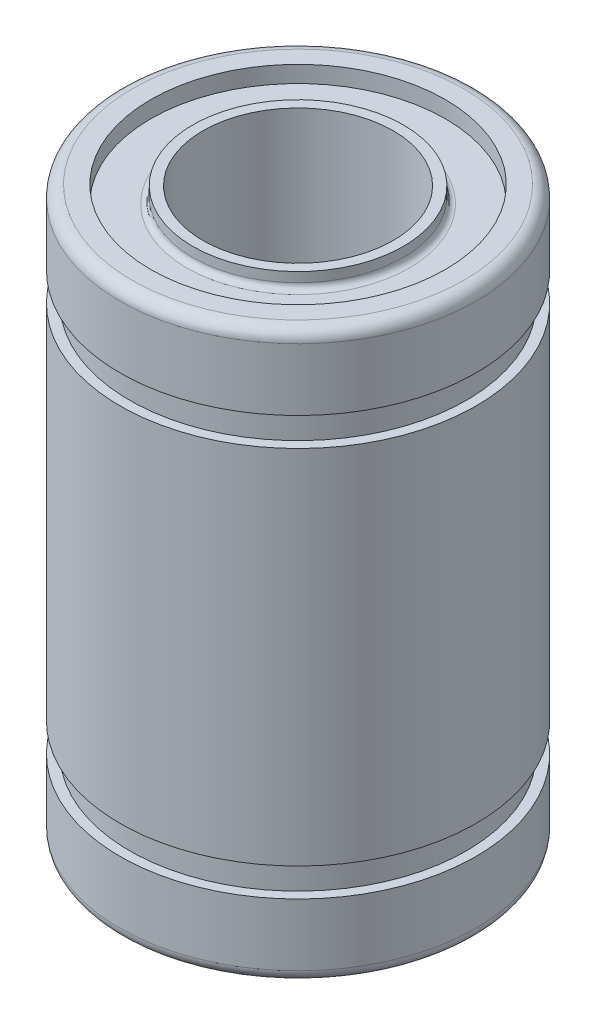
ISO-10303-21;
HEADER;
FILE_DESCRIPTION(('STEP AP214'),'2;1');
FILE_NAME('part.step','',(''),(''),'','','');
FILE_SCHEMA(('AUTOMOTIVE_DESIGN { 1 0 10303 214 1 1 1 1 }'));
ENDSEC;
DATA;
#1=APPLICATION_CONTEXT('core data for automotive mechanical design processes');
#2=APPLICATION_PROTOCOL_DEFINITION('international standard','automotive_design',2000,#1);
#3=PRODUCT_CONTEXT('',#1,'mechanical');
#4=PRODUCT('Part','Part','',(#3));
#5=PRODUCT_RELATED_PRODUCT_CATEGORY('part','',(#4));
#6=PRODUCT_DEFINITION_FORMATION('','',#4);
#7=PRODUCT_DEFINITION_CONTEXT('part definition',#1,'design');
#8=PRODUCT_DEFINITION('design','',#6,#7);
#9=PRODUCT_DEFINITION_SHAPE('','',#8);
#10=(LENGTH_UNIT() NAMED_UNIT(*) SI_UNIT(.MILLI.,.METRE.));
#11=(NAMED_UNIT(*) PLANE_ANGLE_UNIT() SI_UNIT($,.RADIAN.));
#12=(NAMED_UNIT(*) SI_UNIT($,.STERADIAN.) SOLID_ANGLE_UNIT());
#13=UNCERTAINTY_MEASURE_WITH_UNIT(LENGTH_MEASURE(1.E-05),#10,'distance_accuracy_value','');
#14=(GEOMETRIC_REPRESENTATION_CONTEXT(3) GLOBAL_UNCERTAINTY_ASSIGNED_CONTEXT((#13)) GLOBAL_UNIT_ASSIGNED_CONTEXT((#10,
#11,#12)) REPRESENTATION_CONTEXT('',''));
#15=CARTESIAN_POINT('',(0.,0.,0.));
#16=DIRECTION('',(0.,0.,1.));
#17=DIRECTION('',(1.,0.,0.));
#18=AXIS2_PLACEMENT_3D('',#15,#16,#17);
#19=CARTESIAN_POINT('',(0.,11.921250002041,0.));
#20=DIRECTION('',(0.,-1.,0.));
#21=DIRECTION('',(0.,0.,-1.));
#22=AXIS2_PLACEMENT_3D('',#19,#20,#21);
#23=CYLINDRICAL_SURFACE('',#22,4.425);
#24=CARTESIAN_POINT('',(0.,11.8804,0.));
#25=DIRECTION('',(0.,-1.,0.));
#26=DIRECTION('',(0.,0.,-1.));
#27=AXIS2_PLACEMENT_3D('',#24,#25,#26);
#28=CIRCLE('',#27,4.425);
#29=CARTESIAN_POINT('',(0.,11.8804,-4.425));
#30=VERTEX_POINT('',#29);
#31=EDGE_CURVE('E107',#30,#30,#28,.T.);
#32=ORIENTED_EDGE('',*,*,#31,.T.);
#33=EDGE_LOOP('',(#32));
#34=FACE_BOUND('',#33,.T.);
#35=CARTESIAN_POINT('',(0.,11.474,0.));
#36=DIRECTION('',(0.,-1.,0.));
#37=DIRECTION('',(0.,0.,-1.));
#38=AXIS2_PLACEMENT_3D('',#35,#36,#37);
#39=CIRCLE('',#38,4.425);
#40=CARTESIAN_POINT('',(0.,11.474,-4.425));
#41=VERTEX_POINT('',#40);
#42=EDGE_CURVE('E10',#41,#41,#39,.T.);
#43=ORIENTED_EDGE('',*,*,#42,.F.);
#44=EDGE_LOOP('',(#43));
#45=FACE_BOUND('',#44,.T.);
#46=ADVANCED_FACE('F31',(#34,#45),#23,.T.);
#47=CARTESIAN_POINT('',(0.,11.474,0.));
#48=DIRECTION('',(0.,-1.,0.));
#49=DIRECTION('',(0.,0.,-1.));
#50=AXIS2_PLACEMENT_3D('',#47,#48,#49);
#51=TOROIDAL_SURFACE('',#50,4.679,0.254);
#52=ORIENTED_EDGE('',*,*,#42,.T.);
#53=EDGE_LOOP('',(#52));
#54=FACE_BOUND('',#53,.T.);
#55=CARTESIAN_POINT('',(0.,11.22,0.));
#56=DIRECTION('',(0.,-1.,0.));
#57=DIRECTION('',(0.,0.,-1.));
#58=AXIS2_PLACEMENT_3D('',#55,#56,#57);
#59=CIRCLE('',#58,4.679);
#60=CARTESIAN_POINT('',(0.,11.22,-4.679));
#61=VERTEX_POINT('',#60);
#62=EDGE_CURVE('E37',#61,#61,#59,.T.);
#63=ORIENTED_EDGE('',*,*,#62,.F.);
#64=EDGE_LOOP('',(#63));
#65=FACE_BOUND('',#64,.T.);
#66=ADVANCED_FACE('F125',(#54,#65),#51,.F.);
#67=CARTESIAN_POINT('',(6.19,11.22,0.));
#68=DIRECTION('',(0.,1.,0.));
#69=DIRECTION('',(0.,0.,1.));
#70=AXIS2_PLACEMENT_3D('',#67,#68,#69);
#71=PLANE('',#70);
#72=ORIENTED_EDGE('',*,*,#62,.T.);
#73=EDGE_LOOP('',(#72));
#74=FACE_BOUND('',#73,.T.);
#75=CARTESIAN_POINT('',(0.,11.22,0.));
#76=DIRECTION('',(0.,-1.,0.));
#77=DIRECTION('',(0.,0.,-1.));
#78=AXIS2_PLACEMENT_3D('',#75,#76,#77);
#79=CIRCLE('',#78,6.19);
#80=CARTESIAN_POINT('',(0.,11.22,-6.19));
#81=VERTEX_POINT('',#80);
#82=EDGE_CURVE('E41',#81,#81,#79,.T.);
#83=ORIENTED_EDGE('',*,*,#82,.F.);
#84=EDGE_LOOP('',(#83));
#85=FACE_BOUND('',#84,.T.);
#86=ADVANCED_FACE('F129',(#74,#85),#71,.T.);
#87=CARTESIAN_POINT('',(0.,11.921250002041,0.));
#88=DIRECTION('',(0.,-1.,0.));
#89=DIRECTION('',(0.,0.,-1.));
#90=AXIS2_PLACEMENT_3D('',#87,#88,#89);
#91=CYLINDRICAL_SURFACE('',#90,6.19);
#92=ORIENTED_EDGE('',*,*,#82,.T.);
#93=EDGE_LOOP('',(#92));
#94=FACE_BOUND('',#93,.T.);
#95=CARTESIAN_POINT('',(0.,11.92,0.));
#96=DIRECTION('',(0.,-1.,0.));
#97=DIRECTION('',(0.,0.,-1.));
#98=AXIS2_PLACEMENT_3D('',#95,#96,#97);
#99=CIRCLE('',#98,6.19);
#100=CARTESIAN_POINT('',(0.,11.92,-6.19));
#101=VERTEX_POINT('',#100);
#102=EDGE_CURVE('E45',#101,#101,#99,.T.);
#103=ORIENTED_EDGE('',*,*,#102,.F.);
#104=EDGE_LOOP('',(#103));
#105=FACE_BOUND('',#104,.T.);
#106=ADVANCED_FACE('F133',(#94,#105),#91,.F.);
#107=CARTESIAN_POINT('',(6.972,11.92,0.));
#108=DIRECTION('',(0.,1.,0.));
#109=DIRECTION('',(0.,0.,1.));
#110=AXIS2_PLACEMENT_3D('',#107,#108,#109);
#111=PLANE('',#110);
#112=ORIENTED_EDGE('',*,*,#102,.T.);
#113=EDGE_LOOP('',(#112));
#114=FACE_BOUND('',#113,.T.);
#115=CARTESIAN_POINT('',(0.,11.92,0.));
#116=DIRECTION('',(0.,-1.,0.));
#117=DIRECTION('',(0.,0.,-1.));
#118=AXIS2_PLACEMENT_3D('',#115,#116,#117);
#119=CIRCLE('',#118,6.972);
#120=CARTESIAN_POINT('',(0.,11.92,-6.972));
#121=VERTEX_POINT('',#120);
#122=EDGE_CURVE('E50',#121,#121,#119,.T.);
#123=ORIENTED_EDGE('',*,*,#122,.F.);
#124=EDGE_LOOP('',(#123));
#125=FACE_BOUND('',#124,.T.);
#126=ADVANCED_FACE('F139',(#114,#125),#111,.T.);
#127=CARTESIAN_POINT('',(0.,11.412,0.));
#128=DIRECTION('',(0.,-1.,0.));
#129=DIRECTION('',(0.,0.,-1.));
#130=AXIS2_PLACEMENT_3D('',#127,#128,#129);
#131=TOROIDAL_SURFACE('',#130,6.972,0.507999999999999);
#132=ORIENTED_EDGE('',*,*,#122,.T.);
#133=EDGE_LOOP('',(#132));
#134=FACE_BOUND('',#133,.T.);
#135=CARTESIAN_POINT('',(0.,11.412,0.));
#136=DIRECTION('',(0.,-1.,0.));
#137=DIRECTION('',(0.,0.,-1.));
#138=AXIS2_PLACEMENT_3D('',#135,#136,#137);
#139=CIRCLE('',#138,7.48);
#140=CARTESIAN_POINT('',(0.,11.412,-7.48));
#141=VERTEX_POINT('',#140);
#142=EDGE_CURVE('E53',#141,#141,#139,.T.);
#143=ORIENTED_EDGE('',*,*,#142,.F.);
#144=EDGE_LOOP('',(#143));
#145=FACE_BOUND('',#144,.T.);
#146=ADVANCED_FACE('F143',(#134,#145),#131,.T.);
#147=CARTESIAN_POINT('',(0.,11.921250002041,0.));
#148=DIRECTION('',(0.,-1.,0.));
#149=DIRECTION('',(0.,0.,-1.));
#150=AXIS2_PLACEMENT_3D('',#147,#148,#149);
#151=CYLINDRICAL_SURFACE('',#150,7.48);
#152=ORIENTED_EDGE('',*,*,#142,.T.);
#153=EDGE_LOOP('',(#152));
#154=FACE_BOUND('',#153,.T.);
#155=CARTESIAN_POINT('',(0.,8.8,0.));
#156=DIRECTION('',(0.,-1.,0.));
#157=DIRECTION('',(0.,0.,-1.));
#158=AXIS2_PLACEMENT_3D('',#155,#156,#157);
#159=CIRCLE('',#158,7.48);
#160=CARTESIAN_POINT('',(0.,8.8,-7.48));
#161=VERTEX_POINT('',#160);
#162=EDGE_CURVE('E56',#161,#161,#159,.T.);
#163=ORIENTED_EDGE('',*,*,#162,.F.);
#164=EDGE_LOOP('',(#163));
#165=FACE_BOUND('',#164,.T.);
#166=ADVANCED_FACE('F147',(#154,#165),#151,.T.);
#167=CARTESIAN_POINT('',(7.075,8.8,0.));
#168=DIRECTION('',(0.,-1.,0.));
#169=DIRECTION('',(0.,0.,-1.));
#170=AXIS2_PLACEMENT_3D('',#167,#168,#169);
#171=PLANE('',#170);
#172=ORIENTED_EDGE('',*,*,#162,.T.);
#173=EDGE_LOOP('',(#172));
#174=FACE_BOUND('',#173,.T.);
#175=CARTESIAN_POINT('',(0.,8.8,0.));
#176=DIRECTION('',(0.,-1.,0.));
#177=DIRECTION('',(0.,0.,-1.));
#178=AXIS2_PLACEMENT_3D('',#175,#176,#177);
#179=CIRCLE('',#178,7.075);
#180=CARTESIAN_POINT('',(0.,8.8,-7.075));
#181=VERTEX_POINT('',#180);
#182=EDGE_CURVE('E59',#181,#181,#179,.T.);
#183=ORIENTED_EDGE('',*,*,#182,.F.);
#184=EDGE_LOOP('',(#183));
#185=FACE_BOUND('',#184,.T.);
#186=ADVANCED_FACE('F151',(#174,#185),#171,.T.);
#187=CARTESIAN_POINT('',(0.,11.921250002041,0.));
#188=DIRECTION('',(0.,-1.,0.));
#189=DIRECTION('',(0.,0.,-1.));
#190=AXIS2_PLACEMENT_3D('',#187,#188,#189);
#191=CYLINDRICAL_SURFACE('',#190,7.075);
#192=ORIENTED_EDGE('',*,*,#182,.T.);
#193=EDGE_LOOP('',(#192));
#194=FACE_BOUND('',#193,.T.);
#195=CARTESIAN_POINT('',(0.,7.6,0.));
#196=DIRECTION('',(0.,-1.,0.));
#197=DIRECTION('',(0.,0.,-1.));
#198=AXIS2_PLACEMENT_3D('',#195,#196,#197);
#199=CIRCLE('',#198,7.075);
#200=CARTESIAN_POINT('',(0.,7.6,-7.075));
#201=VERTEX_POINT('',#200);
#202=EDGE_CURVE('E62',#201,#201,#199,.T.);
#203=ORIENTED_EDGE('',*,*,#202,.F.);
#204=EDGE_LOOP('',(#203));
#205=FACE_BOUND('',#204,.T.);
#206=ADVANCED_FACE('F155',(#194,#205),#191,.T.);
#207=CARTESIAN_POINT('',(7.48,7.6,0.));
#208=DIRECTION('',(0.,1.,0.));
#209=DIRECTION('',(0.,0.,1.));
#210=AXIS2_PLACEMENT_3D('',#207,#208,#209);
#211=PLANE('',#210);
#212=ORIENTED_EDGE('',*,*,#202,.T.);
#213=EDGE_LOOP('',(#212));
#214=FACE_BOUND('',#213,.T.);
#215=CARTESIAN_POINT('',(0.,7.6,0.));
#216=DIRECTION('',(0.,-1.,0.));
#217=DIRECTION('',(0.,0.,-1.));
#218=AXIS2_PLACEMENT_3D('',#215,#216,#217);
#219=CIRCLE('',#218,7.48);
#220=CARTESIAN_POINT('',(0.,7.6,-7.48));
#221=VERTEX_POINT('',#220);
#222=EDGE_CURVE('E65',#221,#221,#219,.T.);
#223=ORIENTED_EDGE('',*,*,#222,.F.);
#224=EDGE_LOOP('',(#223));
#225=FACE_BOUND('',#224,.T.);
#226=ADVANCED_FACE('F159',(#214,#225),#211,.T.);
#227=CARTESIAN_POINT('',(0.,11.921250002041,0.));
#228=DIRECTION('',(0.,-1.,0.));
#229=DIRECTION('',(0.,0.,-1.));
#230=AXIS2_PLACEMENT_3D('',#227,#228,#229);
#231=CYLINDRICAL_SURFACE('',#230,7.48);
#232=ORIENTED_EDGE('',*,*,#222,.T.);
#233=EDGE_LOOP('',(#232));
#234=FACE_BOUND('',#233,.T.);
#235=CARTESIAN_POINT('',(0.,-7.6,0.));
#236=DIRECTION('',(0.,-1.,0.));
#237=DIRECTION('',(0.,0.,-1.));
#238=AXIS2_PLACEMENT_3D('',#235,#236,#237);
#239=CIRCLE('',#238,7.48);
#240=CARTESIAN_POINT('',(0.,-7.6,-7.48));
#241=VERTEX_POINT('',#240);
#242=EDGE_CURVE('E68',#241,#241,#239,.T.);
#243=ORIENTED_EDGE('',*,*,#242,.F.);
#244=EDGE_LOOP('',(#243));
#245=FACE_BOUND('',#244,.T.);
#246=ADVANCED_FACE('F163',(#234,#245),#231,.T.);
#247=CARTESIAN_POINT('',(7.075,-7.6,0.));
#248=DIRECTION('',(0.,-1.,0.));
#249=DIRECTION('',(0.,0.,-1.));
#250=AXIS2_PLACEMENT_3D('',#247,#248,#249);
#251=PLANE('',#250);
#252=ORIENTED_EDGE('',*,*,#242,.T.);
#253=EDGE_LOOP('',(#252));
#254=FACE_BOUND('',#253,.T.);
#255=CARTESIAN_POINT('',(0.,-7.6,0.));
#256=DIRECTION('',(0.,-1.,0.));
#257=DIRECTION('',(0.,0.,-1.));
#258=AXIS2_PLACEMENT_3D('',#255,#256,#257);
#259=CIRCLE('',#258,7.075);
#260=CARTESIAN_POINT('',(0.,-7.6,-7.075));
#261=VERTEX_POINT('',#260);
#262=EDGE_CURVE('E71',#261,#261,#259,.T.);
#263=ORIENTED_EDGE('',*,*,#262,.F.);
#264=EDGE_LOOP('',(#263));
#265=FACE_BOUND('',#264,.T.);
#266=ADVANCED_FACE('F167',(#254,#265),#251,.T.);
#267=CARTESIAN_POINT('',(0.,11.921250002041,0.));
#268=DIRECTION('',(0.,-1.,0.));
#269=DIRECTION('',(0.,0.,-1.));
#270=AXIS2_PLACEMENT_3D('',#267,#268,#269);
#271=CYLINDRICAL_SURFACE('',#270,7.075);
#272=ORIENTED_EDGE('',*,*,#262,.T.);
#273=EDGE_LOOP('',(#272));
#274=FACE_BOUND('',#273,.T.);
#275=CARTESIAN_POINT('',(0.,-8.8,0.));
#276=DIRECTION('',(0.,-1.,0.));
#277=DIRECTION('',(0.,0.,-1.));
#278=AXIS2_PLACEMENT_3D('',#275,#276,#277);
#279=CIRCLE('',#278,7.075);
#280=CARTESIAN_POINT('',(0.,-8.8,-7.075));
#281=VERTEX_POINT('',#280);
#282=EDGE_CURVE('E74',#281,#281,#279,.T.);
#283=ORIENTED_EDGE('',*,*,#282,.F.);
#284=EDGE_LOOP('',(#283));
#285=FACE_BOUND('',#284,.T.);
#286=ADVANCED_FACE('F171',(#274,#285),#271,.T.);
#287=CARTESIAN_POINT('',(7.48,-8.8,0.));
#288=DIRECTION('',(0.,1.,0.));
#289=DIRECTION('',(0.,0.,1.));
#290=AXIS2_PLACEMENT_3D('',#287,#288,#289);
#291=PLANE('',#290);
#292=ORIENTED_EDGE('',*,*,#282,.T.);
#293=EDGE_LOOP('',(#292));
#294=FACE_BOUND('',#293,.T.);
#295=CARTESIAN_POINT('',(0.,-8.8,0.));
#296=DIRECTION('',(0.,-1.,0.));
#297=DIRECTION('',(0.,0.,-1.));
#298=AXIS2_PLACEMENT_3D('',#295,#296,#297);
#299=CIRCLE('',#298,7.48);
#300=CARTESIAN_POINT('',(0.,-8.8,-7.48));
#301=VERTEX_POINT('',#300);
#302=EDGE_CURVE('E77',#301,#301,#299,.T.);
#303=ORIENTED_EDGE('',*,*,#302,.F.);
#304=EDGE_LOOP('',(#303));
#305=FACE_BOUND('',#304,.T.);
#306=ADVANCED_FACE('F175',(#294,#305),#291,.T.);
#307=CARTESIAN_POINT('',(0.,11.921250002041,0.));
#308=DIRECTION('',(0.,-1.,0.));
#309=DIRECTION('',(0.,0.,-1.));
#310=AXIS2_PLACEMENT_3D('',#307,#308,#309);
#311=CYLINDRICAL_SURFACE('',#310,7.48);
#312=ORIENTED_EDGE('',*,*,#302,.T.);
#313=EDGE_LOOP('',(#312));
#314=FACE_BOUND('',#313,.T.);
#315=CARTESIAN_POINT('',(0.,-11.412,0.));
#316=DIRECTION('',(0.,-1.,0.));
#317=DIRECTION('',(0.,0.,-1.));
#318=AXIS2_PLACEMENT_3D('',#315,#316,#317);
#319=CIRCLE('',#318,7.48);
#320=CARTESIAN_POINT('',(0.,-11.412,-7.48));
#321=VERTEX_POINT('',#320);
#322=EDGE_CURVE('E80',#321,#321,#319,.T.);
#323=ORIENTED_EDGE('',*,*,#322,.F.);
#324=EDGE_LOOP('',(#323));
#325=FACE_BOUND('',#324,.T.);
#326=ADVANCED_FACE('F179',(#314,#325),#311,.T.);
#327=CARTESIAN_POINT('',(0.,-11.412,0.));
#328=DIRECTION('',(0.,-1.,0.));
#329=DIRECTION('',(0.,0.,-1.));
#330=AXIS2_PLACEMENT_3D('',#327,#328,#329);
#331=TOROIDAL_SURFACE('',#330,6.972,0.508000000000001);
#332=ORIENTED_EDGE('',*,*,#322,.T.);
#333=EDGE_LOOP('',(#332));
#334=FACE_BOUND('',#333,.T.);
#335=CARTESIAN_POINT('',(0.,-11.92,0.));
#336=DIRECTION('',(0.,-1.,0.));
#337=DIRECTION('',(0.,0.,-1.));
#338=AXIS2_PLACEMENT_3D('',#335,#336,#337);
#339=CIRCLE('',#338,6.97200000000008);
#340=CARTESIAN_POINT('',(0.,-11.92,-6.97200000000008));
#341=VERTEX_POINT('',#340);
#342=EDGE_CURVE('E83',#341,#341,#339,.T.);
#343=ORIENTED_EDGE('',*,*,#342,.F.);
#344=EDGE_LOOP('',(#343));
#345=FACE_BOUND('',#344,.T.);
#346=ADVANCED_FACE('F183',(#334,#345),#331,.T.);
#347=CARTESIAN_POINT('',(6.19,-11.92,0.));
#348=DIRECTION('',(0.,-1.,0.));
#349=DIRECTION('',(0.,0.,-1.));
#350=AXIS2_PLACEMENT_3D('',#347,#348,#349);
#351=PLANE('',#350);
#352=ORIENTED_EDGE('',*,*,#342,.T.);
#353=EDGE_LOOP('',(#352));
#354=FACE_BOUND('',#353,.T.);
#355=CARTESIAN_POINT('',(0.,-11.92,0.));
#356=DIRECTION('',(0.,-1.,0.));
#357=DIRECTION('',(0.,0.,-1.));
#358=AXIS2_PLACEMENT_3D('',#355,#356,#357);
#359=CIRCLE('',#358,6.19);
#360=CARTESIAN_POINT('',(0.,-11.92,-6.19));
#361=VERTEX_POINT('',#360);
#362=EDGE_CURVE('E86',#361,#361,#359,.T.);
#363=ORIENTED_EDGE('',*,*,#362,.F.);
#364=EDGE_LOOP('',(#363));
#365=FACE_BOUND('',#364,.T.);
#366=ADVANCED_FACE('F187',(#354,#365),#351,.T.);
#367=CARTESIAN_POINT('',(0.,11.921250002041,0.));
#368=DIRECTION('',(0.,-1.,0.));
#369=DIRECTION('',(0.,0.,-1.));
#370=AXIS2_PLACEMENT_3D('',#367,#368,#369);
#371=CYLINDRICAL_SURFACE('',#370,6.19);
#372=ORIENTED_EDGE('',*,*,#362,.T.);
#373=EDGE_LOOP('',(#372));
#374=FACE_BOUND('',#373,.T.);
#375=CARTESIAN_POINT('',(0.,-11.22,0.));
#376=DIRECTION('',(0.,-1.,0.));
#377=DIRECTION('',(0.,0.,-1.));
#378=AXIS2_PLACEMENT_3D('',#375,#376,#377);
#379=CIRCLE('',#378,6.19);
#380=CARTESIAN_POINT('',(0.,-11.22,-6.19));
#381=VERTEX_POINT('',#380);
#382=EDGE_CURVE('E89',#381,#381,#379,.T.);
#383=ORIENTED_EDGE('',*,*,#382,.F.);
#384=EDGE_LOOP('',(#383));
#385=FACE_BOUND('',#384,.T.);
#386=ADVANCED_FACE('F191',(#374,#385),#371,.F.);
#387=CARTESIAN_POINT('',(4.679,-11.22,0.));
#388=DIRECTION('',(0.,-1.,0.));
#389=DIRECTION('',(0.,0.,-1.));
#390=AXIS2_PLACEMENT_3D('',#387,#388,#389);
#391=PLANE('',#390);
#392=ORIENTED_EDGE('',*,*,#382,.T.);
#393=EDGE_LOOP('',(#392));
#394=FACE_BOUND('',#393,.T.);
#395=CARTESIAN_POINT('',(0.,-11.22,0.));
#396=DIRECTION('',(0.,-1.,0.));
#397=DIRECTION('',(0.,0.,-1.));
#398=AXIS2_PLACEMENT_3D('',#395,#396,#397);
#399=CIRCLE('',#398,4.679);
#400=CARTESIAN_POINT('',(0.,-11.22,-4.679));
#401=VERTEX_POINT('',#400);
#402=EDGE_CURVE('E92',#401,#401,#399,.T.);
#403=ORIENTED_EDGE('',*,*,#402,.F.);
#404=EDGE_LOOP('',(#403));
#405=FACE_BOUND('',#404,.T.);
#406=ADVANCED_FACE('F195',(#394,#405),#391,.T.);
#407=CARTESIAN_POINT('',(0.,-11.474,0.));
#408=DIRECTION('',(0.,-1.,0.));
#409=DIRECTION('',(0.,0.,-1.));
#410=AXIS2_PLACEMENT_3D('',#407,#408,#409);
#411=TOROIDAL_SURFACE('',#410,4.679,0.254);
#412=ORIENTED_EDGE('',*,*,#402,.T.);
#413=EDGE_LOOP('',(#412));
#414=FACE_BOUND('',#413,.T.);
#415=CARTESIAN_POINT('',(0.,-11.474,0.));
#416=DIRECTION('',(0.,-1.,0.));
#417=DIRECTION('',(0.,0.,-1.));
#418=AXIS2_PLACEMENT_3D('',#415,#416,#417);
#419=CIRCLE('',#418,4.425);
#420=CARTESIAN_POINT('',(0.,-11.474,-4.425));
#421=VERTEX_POINT('',#420);
#422=EDGE_CURVE('E95',#421,#421,#419,.T.);
#423=ORIENTED_EDGE('',*,*,#422,.F.);
#424=EDGE_LOOP('',(#423));
#425=FACE_BOUND('',#424,.T.);
#426=ADVANCED_FACE('F199',(#414,#425),#411,.F.);
#427=CARTESIAN_POINT('',(0.,11.921250002041,0.));
#428=DIRECTION('',(0.,-1.,0.));
#429=DIRECTION('',(0.,0.,-1.));
#430=AXIS2_PLACEMENT_3D('',#427,#428,#429);
#431=CYLINDRICAL_SURFACE('',#430,4.425);
#432=ORIENTED_EDGE('',*,*,#422,.T.);
#433=EDGE_LOOP('',(#432));
#434=FACE_BOUND('',#433,.T.);
#435=CARTESIAN_POINT('',(0.,-11.8804,0.));
#436=DIRECTION('',(0.,-1.,0.));
#437=DIRECTION('',(0.,0.,-1.));
#438=AXIS2_PLACEMENT_3D('',#435,#436,#437);
#439=CIRCLE('',#438,4.425);
#440=CARTESIAN_POINT('',(0.,-11.8804,-4.425));
#441=VERTEX_POINT('',#440);
#442=EDGE_CURVE('E98',#441,#441,#439,.T.);
#443=ORIENTED_EDGE('',*,*,#442,.F.);
#444=EDGE_LOOP('',(#443));
#445=FACE_BOUND('',#444,.T.);
#446=ADVANCED_FACE('F203',(#434,#445),#431,.T.);
#447=CARTESIAN_POINT('',(4.,-11.8804,0.));
#448=DIRECTION('',(0.,-1.,0.));
#449=DIRECTION('',(0.,0.,-1.));
#450=AXIS2_PLACEMENT_3D('',#447,#448,#449);
#451=PLANE('',#450);
#452=ORIENTED_EDGE('',*,*,#442,.T.);
#453=EDGE_LOOP('',(#452));
#454=FACE_BOUND('',#453,.T.);
#455=CARTESIAN_POINT('',(0.,-11.8804,0.));
#456=DIRECTION('',(0.,-1.,0.));
#457=DIRECTION('',(0.,0.,-1.));
#458=AXIS2_PLACEMENT_3D('',#455,#456,#457);
#459=CIRCLE('',#458,4.);
#460=CARTESIAN_POINT('',(0.,-11.8804,-4.));
#461=VERTEX_POINT('',#460);
#462=EDGE_CURVE('E101',#461,#461,#459,.T.);
#463=ORIENTED_EDGE('',*,*,#462,.F.);
#464=EDGE_LOOP('',(#463));
#465=FACE_BOUND('',#464,.T.);
#466=ADVANCED_FACE('F121',(#454,#465),#451,.T.);
#467=CARTESIAN_POINT('',(0.,11.921250002041,0.));
#468=DIRECTION('',(0.,-1.,0.));
#469=DIRECTION('',(0.,0.,-1.));
#470=AXIS2_PLACEMENT_3D('',#467,#468,#469);
#471=CYLINDRICAL_SURFACE('',#470,4.);
#472=ORIENTED_EDGE('',*,*,#462,.T.);
#473=EDGE_LOOP('',(#472));
#474=FACE_BOUND('',#473,.T.);
#475=CARTESIAN_POINT('',(0.,11.8804,0.));
#476=DIRECTION('',(0.,-1.,0.));
#477=DIRECTION('',(0.,0.,-1.));
#478=AXIS2_PLACEMENT_3D('',#475,#476,#477);
#479=CIRCLE('',#478,4.);
#480=CARTESIAN_POINT('',(0.,11.8804,-4.));
#481=VERTEX_POINT('',#480);
#482=EDGE_CURVE('E104',#481,#481,#479,.T.);
#483=ORIENTED_EDGE('',*,*,#482,.F.);
#484=EDGE_LOOP('',(#483));
#485=FACE_BOUND('',#484,.T.);
#486=ADVANCED_FACE('F115',(#474,#485),#471,.F.);
#487=CARTESIAN_POINT('',(4.425,11.8804,0.));
#488=DIRECTION('',(0.,1.,0.));
#489=DIRECTION('',(0.,0.,1.));
#490=AXIS2_PLACEMENT_3D('',#487,#488,#489);
#491=PLANE('',#490);
#492=ORIENTED_EDGE('',*,*,#482,.T.);
#493=EDGE_LOOP('',(#492));
#494=FACE_BOUND('',#493,.T.);
#495=ORIENTED_EDGE('',*,*,#31,.F.);
#496=EDGE_LOOP('',(#495));
#497=FACE_BOUND('',#496,.T.);
#498=ADVANCED_FACE('F113',(#494,#497),#491,.T.);
#499=CLOSED_SHELL('',(#46,#66,#86,#106,#126,#146,#166,#186,#206,#226,#246,#266,#286,#306,#326,
#346,#366,#386,#406,#426,#446,#466,#486,#498));
#500=MANIFOLD_SOLID_BREP('B2',#499);
#501=ADVANCED_BREP_SHAPE_REPRESENTATION('',(#18,#500),#14);
#502=SHAPE_DEFINITION_REPRESENTATION(#9,#501);
ENDSEC;
END-ISO-10303-21;
